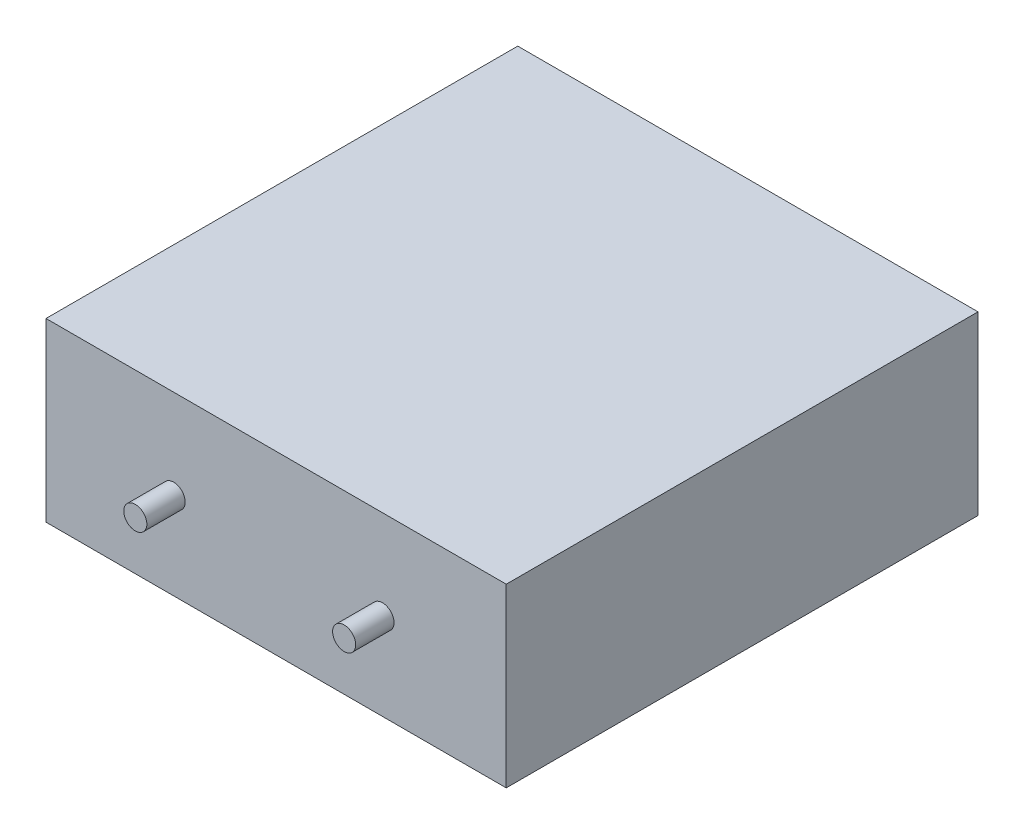
ISO-10303-21;
HEADER;
FILE_DESCRIPTION(('STEP AP214'),'2;1');
FILE_NAME('part.step','',(''),(''),'','','');
FILE_SCHEMA(('AUTOMOTIVE_DESIGN { 1 0 10303 214 1 1 1 1 }'));
ENDSEC;
DATA;
#1=APPLICATION_CONTEXT('core data for automotive mechanical design processes');
#2=APPLICATION_PROTOCOL_DEFINITION('international standard','automotive_design',2000,#1);
#3=PRODUCT_CONTEXT('',#1,'mechanical');
#4=PRODUCT('Part','Part','',(#3));
#5=PRODUCT_RELATED_PRODUCT_CATEGORY('part','',(#4));
#6=PRODUCT_DEFINITION_FORMATION('','',#4);
#7=PRODUCT_DEFINITION_CONTEXT('part definition',#1,'design');
#8=PRODUCT_DEFINITION('design','',#6,#7);
#9=PRODUCT_DEFINITION_SHAPE('','',#8);
#10=(LENGTH_UNIT() NAMED_UNIT(*) SI_UNIT(.MILLI.,.METRE.));
#11=(NAMED_UNIT(*) PLANE_ANGLE_UNIT() SI_UNIT($,.RADIAN.));
#12=(NAMED_UNIT(*) SI_UNIT($,.STERADIAN.) SOLID_ANGLE_UNIT());
#13=UNCERTAINTY_MEASURE_WITH_UNIT(LENGTH_MEASURE(1.E-05),#10,'distance_accuracy_value','');
#14=(GEOMETRIC_REPRESENTATION_CONTEXT(3) GLOBAL_UNCERTAINTY_ASSIGNED_CONTEXT((#13)) GLOBAL_UNIT_ASSIGNED_CONTEXT((#10,
#11,#12)) REPRESENTATION_CONTEXT('',''));
#15=CARTESIAN_POINT('',(0.,0.,0.));
#16=DIRECTION('',(0.,0.,1.));
#17=DIRECTION('',(1.,0.,0.));
#18=AXIS2_PLACEMENT_3D('',#15,#16,#17);
#19=CARTESIAN_POINT('',(-60.,46.,61.5));
#20=DIRECTION('',(1.,0.,0.));
#21=DIRECTION('',(0.,0.,-1.));
#22=AXIS2_PLACEMENT_3D('',#19,#20,#21);
#23=PLANE('',#22);
#24=DIRECTION('',(0.,0.,1.));
#25=VECTOR('',#24,1.);
#26=CARTESIAN_POINT('',(-60.,0.,61.5));
#27=LINE('',#26,#25);
#28=CARTESIAN_POINT('',(-60.,0.,-61.5));
#29=VERTEX_POINT('',#28);
#30=CARTESIAN_POINT('',(-60.,0.,61.5));
#31=VERTEX_POINT('',#30);
#32=EDGE_CURVE('E108',#29,#31,#27,.T.);
#33=ORIENTED_EDGE('',*,*,#32,.T.);
#34=DIRECTION('',(0.,-1.,0.));
#35=VECTOR('',#34,1.);
#36=CARTESIAN_POINT('',(-60.,46.,61.5));
#37=LINE('',#36,#35);
#38=CARTESIAN_POINT('',(-60.,46.,61.5));
#39=VERTEX_POINT('',#38);
#40=EDGE_CURVE('E99',#39,#31,#37,.T.);
#41=ORIENTED_EDGE('',*,*,#40,.F.);
#42=DIRECTION('',(0.,0.,1.));
#43=VECTOR('',#42,1.);
#44=CARTESIAN_POINT('',(-60.,46.,61.5));
#45=LINE('',#44,#43);
#46=CARTESIAN_POINT('',(-60.,46.,-61.5));
#47=VERTEX_POINT('',#46);
#48=EDGE_CURVE('E93',#47,#39,#45,.T.);
#49=ORIENTED_EDGE('',*,*,#48,.F.);
#50=DIRECTION('',(0.,-1.,0.));
#51=VECTOR('',#50,1.);
#52=CARTESIAN_POINT('',(-60.,46.,-61.5));
#53=LINE('',#52,#51);
#54=EDGE_CURVE('E104',#47,#29,#53,.T.);
#55=ORIENTED_EDGE('',*,*,#54,.T.);
#56=EDGE_LOOP('',(#33,#41,#49,#55));
#57=FACE_BOUND('',#56,.T.);
#58=ADVANCED_FACE('F41',(#57),#23,.F.);
#59=CARTESIAN_POINT('',(60.,46.,61.5));
#60=DIRECTION('',(0.,0.,-1.));
#61=DIRECTION('',(-1.,0.,0.));
#62=AXIS2_PLACEMENT_3D('',#59,#60,#61);
#63=PLANE('',#62);
#64=CARTESIAN_POINT('',(-26.7170270707589,22.6697895530585,61.5));
#65=DIRECTION('',(0.,0.,-1.));
#66=DIRECTION('',(-1.,0.,0.));
#67=AXIS2_PLACEMENT_3D('',#64,#65,#66);
#68=CIRCLE('',#67,3.00731174332971);
#69=CARTESIAN_POINT('',(-29.7243388140886,22.6697895530585,61.5));
#70=VERTEX_POINT('',#69);
#71=EDGE_CURVE('E11',#70,#70,#68,.F.);
#72=ORIENTED_EDGE('',*,*,#71,.F.);
#73=EDGE_LOOP('',(#72));
#74=FACE_BOUND('',#73,.T.);
#75=CARTESIAN_POINT('',(27.737677543125,22.6697895530585,61.5));
#76=DIRECTION('',(0.,0.,-1.));
#77=DIRECTION('',(-1.,0.,0.));
#78=AXIS2_PLACEMENT_3D('',#75,#76,#77);
#79=CIRCLE('',#78,3.00731174332971);
#80=CARTESIAN_POINT('',(24.7303657997953,22.6697895530585,61.5));
#81=VERTEX_POINT('',#80);
#82=EDGE_CURVE('E49',#81,#81,#79,.F.);
#83=ORIENTED_EDGE('',*,*,#82,.F.);
#84=EDGE_LOOP('',(#83));
#85=FACE_BOUND('',#84,.T.);
#86=DIRECTION('',(1.,0.,0.));
#87=VECTOR('',#86,1.);
#88=CARTESIAN_POINT('',(60.,0.,61.5));
#89=LINE('',#88,#87);
#90=CARTESIAN_POINT('',(60.,0.,61.5));
#91=VERTEX_POINT('',#90);
#92=EDGE_CURVE('E98',#31,#91,#89,.T.);
#93=ORIENTED_EDGE('',*,*,#92,.T.);
#94=DIRECTION('',(0.,-1.,0.));
#95=VECTOR('',#94,1.);
#96=CARTESIAN_POINT('',(60.,46.,61.5));
#97=LINE('',#96,#95);
#98=CARTESIAN_POINT('',(60.,46.,61.5));
#99=VERTEX_POINT('',#98);
#100=EDGE_CURVE('E96',#99,#91,#97,.T.);
#101=ORIENTED_EDGE('',*,*,#100,.F.);
#102=DIRECTION('',(1.,0.,0.));
#103=VECTOR('',#102,1.);
#104=CARTESIAN_POINT('',(60.,46.,61.5));
#105=LINE('',#104,#103);
#106=EDGE_CURVE('E88',#39,#99,#105,.T.);
#107=ORIENTED_EDGE('',*,*,#106,.F.);
#108=ORIENTED_EDGE('',*,*,#40,.T.);
#109=EDGE_LOOP('',(#93,#101,#107,#108));
#110=FACE_BOUND('',#109,.T.);
#111=ADVANCED_FACE('F97',(#74,#85,#110),#63,.F.);
#112=CARTESIAN_POINT('',(60.,46.,61.5));
#113=DIRECTION('',(-1.,0.,0.));
#114=DIRECTION('',(0.,0.,1.));
#115=AXIS2_PLACEMENT_3D('',#112,#113,#114);
#116=PLANE('',#115);
#117=DIRECTION('',(0.,0.,-1.));
#118=VECTOR('',#117,1.);
#119=CARTESIAN_POINT('',(60.,0.,61.5));
#120=LINE('',#119,#118);
#121=CARTESIAN_POINT('',(60.,0.,-61.5));
#122=VERTEX_POINT('',#121);
#123=EDGE_CURVE('E74',#91,#122,#120,.T.);
#124=ORIENTED_EDGE('',*,*,#123,.T.);
#125=DIRECTION('',(0.,-1.,0.));
#126=VECTOR('',#125,1.);
#127=CARTESIAN_POINT('',(60.,46.,-61.5));
#128=LINE('',#127,#126);
#129=CARTESIAN_POINT('',(60.,46.,-61.5));
#130=VERTEX_POINT('',#129);
#131=EDGE_CURVE('E100',#130,#122,#128,.T.);
#132=ORIENTED_EDGE('',*,*,#131,.F.);
#133=DIRECTION('',(0.,0.,-1.));
#134=VECTOR('',#133,1.);
#135=CARTESIAN_POINT('',(60.,46.,61.5));
#136=LINE('',#135,#134);
#137=EDGE_CURVE('E91',#99,#130,#136,.T.);
#138=ORIENTED_EDGE('',*,*,#137,.F.);
#139=ORIENTED_EDGE('',*,*,#100,.T.);
#140=EDGE_LOOP('',(#124,#132,#138,#139));
#141=FACE_BOUND('',#140,.T.);
#142=ADVANCED_FACE('F102',(#141),#116,.F.);
#143=CARTESIAN_POINT('',(60.,46.,-61.5));
#144=DIRECTION('',(0.,0.,1.));
#145=DIRECTION('',(1.,0.,0.));
#146=AXIS2_PLACEMENT_3D('',#143,#144,#145);
#147=PLANE('',#146);
#148=DIRECTION('',(-1.,0.,0.));
#149=VECTOR('',#148,1.);
#150=CARTESIAN_POINT('',(60.,0.,-61.5));
#151=LINE('',#150,#149);
#152=EDGE_CURVE('E80',#122,#29,#151,.T.);
#153=ORIENTED_EDGE('',*,*,#152,.T.);
#154=ORIENTED_EDGE('',*,*,#54,.F.);
#155=DIRECTION('',(-1.,0.,0.));
#156=VECTOR('',#155,1.);
#157=CARTESIAN_POINT('',(60.,46.,-61.5));
#158=LINE('',#157,#156);
#159=EDGE_CURVE('E57',#130,#47,#158,.T.);
#160=ORIENTED_EDGE('',*,*,#159,.F.);
#161=ORIENTED_EDGE('',*,*,#131,.T.);
#162=EDGE_LOOP('',(#153,#154,#160,#161));
#163=FACE_BOUND('',#162,.T.);
#164=ADVANCED_FACE('F129',(#163),#147,.F.);
#165=CARTESIAN_POINT('',(0.,46.,0.));
#166=DIRECTION('',(0.,1.,0.));
#167=DIRECTION('',(0.,0.,1.));
#168=AXIS2_PLACEMENT_3D('',#165,#166,#167);
#169=PLANE('',#168);
#170=ORIENTED_EDGE('',*,*,#48,.T.);
#171=ORIENTED_EDGE('',*,*,#106,.T.);
#172=ORIENTED_EDGE('',*,*,#137,.T.);
#173=ORIENTED_EDGE('',*,*,#159,.T.);
#174=EDGE_LOOP('',(#170,#171,#172,#173));
#175=FACE_BOUND('',#174,.T.);
#176=ADVANCED_FACE('F89',(#175),#169,.T.);
#177=CARTESIAN_POINT('',(0.,0.,0.));
#178=DIRECTION('',(0.,1.,0.));
#179=DIRECTION('',(0.,0.,1.));
#180=AXIS2_PLACEMENT_3D('',#177,#178,#179);
#181=PLANE('',#180);
#182=ORIENTED_EDGE('',*,*,#32,.F.);
#183=ORIENTED_EDGE('',*,*,#152,.F.);
#184=ORIENTED_EDGE('',*,*,#123,.F.);
#185=ORIENTED_EDGE('',*,*,#92,.F.);
#186=EDGE_LOOP('',(#182,#183,#184,#185));
#187=FACE_BOUND('',#186,.T.);
#188=ADVANCED_FACE('F137',(#187),#181,.F.);
#189=CARTESIAN_POINT('',(27.737677543125,22.6697895530585,71.5));
#190=DIRECTION('',(0.,0.,-1.));
#191=DIRECTION('',(-1.,0.,0.));
#192=AXIS2_PLACEMENT_3D('',#189,#190,#191);
#193=CYLINDRICAL_SURFACE('',#192,3.00731174332971);
#194=CARTESIAN_POINT('',(27.737677543125,22.6697895530585,71.5));
#195=DIRECTION('',(0.,0.,1.));
#196=DIRECTION('',(1.,0.,0.));
#197=AXIS2_PLACEMENT_3D('',#194,#195,#196);
#198=CIRCLE('',#197,3.00731174332971);
#199=CARTESIAN_POINT('',(30.7449892864547,22.6697895530585,71.5));
#200=VERTEX_POINT('',#199);
#201=EDGE_CURVE('E159',#200,#200,#198,.T.);
#202=ORIENTED_EDGE('',*,*,#201,.F.);
#203=EDGE_LOOP('',(#202));
#204=FACE_BOUND('',#203,.T.);
#205=ORIENTED_EDGE('',*,*,#82,.T.);
#206=EDGE_LOOP('',(#205));
#207=FACE_BOUND('',#206,.T.);
#208=ADVANCED_FACE('F120',(#204,#207),#193,.T.);
#209=CARTESIAN_POINT('',(27.737677543125,22.6697895530585,71.5));
#210=DIRECTION('',(0.,0.,1.));
#211=DIRECTION('',(1.,0.,0.));
#212=AXIS2_PLACEMENT_3D('',#209,#210,#211);
#213=PLANE('',#212);
#214=ORIENTED_EDGE('',*,*,#201,.T.);
#215=EDGE_LOOP('',(#214));
#216=FACE_BOUND('',#215,.T.);
#217=ADVANCED_FACE('F142',(#216),#213,.T.);
#218=CARTESIAN_POINT('',(-26.7170270707589,22.6697895530585,71.5));
#219=DIRECTION('',(0.,0.,-1.));
#220=DIRECTION('',(-1.,0.,0.));
#221=AXIS2_PLACEMENT_3D('',#218,#219,#220);
#222=CYLINDRICAL_SURFACE('',#221,3.00731174332971);
#223=CARTESIAN_POINT('',(-26.7170270707589,22.6697895530585,71.5));
#224=DIRECTION('',(0.,0.,1.));
#225=DIRECTION('',(1.,0.,0.));
#226=AXIS2_PLACEMENT_3D('',#223,#224,#225);
#227=CIRCLE('',#226,3.00731174332971);
#228=CARTESIAN_POINT('',(-23.7097153274292,22.6697895530585,71.5));
#229=VERTEX_POINT('',#228);
#230=EDGE_CURVE('E111',#229,#229,#227,.T.);
#231=ORIENTED_EDGE('',*,*,#230,.F.);
#232=EDGE_LOOP('',(#231));
#233=FACE_BOUND('',#232,.T.);
#234=ORIENTED_EDGE('',*,*,#71,.T.);
#235=EDGE_LOOP('',(#234));
#236=FACE_BOUND('',#235,.T.);
#237=ADVANCED_FACE('F145',(#233,#236),#222,.T.);
#238=CARTESIAN_POINT('',(-26.7170270707589,22.6697895530585,71.5));
#239=DIRECTION('',(0.,0.,1.));
#240=DIRECTION('',(1.,0.,0.));
#241=AXIS2_PLACEMENT_3D('',#238,#239,#240);
#242=PLANE('',#241);
#243=ORIENTED_EDGE('',*,*,#230,.T.);
#244=EDGE_LOOP('',(#243));
#245=FACE_BOUND('',#244,.T.);
#246=ADVANCED_FACE('F151',(#245),#242,.T.);
#247=CLOSED_SHELL('',(#58,#111,#142,#164,#176,#188,#208,#217,#237,#246));
#248=MANIFOLD_SOLID_BREP('B2',#247);
#249=ADVANCED_BREP_SHAPE_REPRESENTATION('',(#18,#248),#14);
#250=SHAPE_DEFINITION_REPRESENTATION(#9,#249);
ENDSEC;
END-ISO-10303-21;
